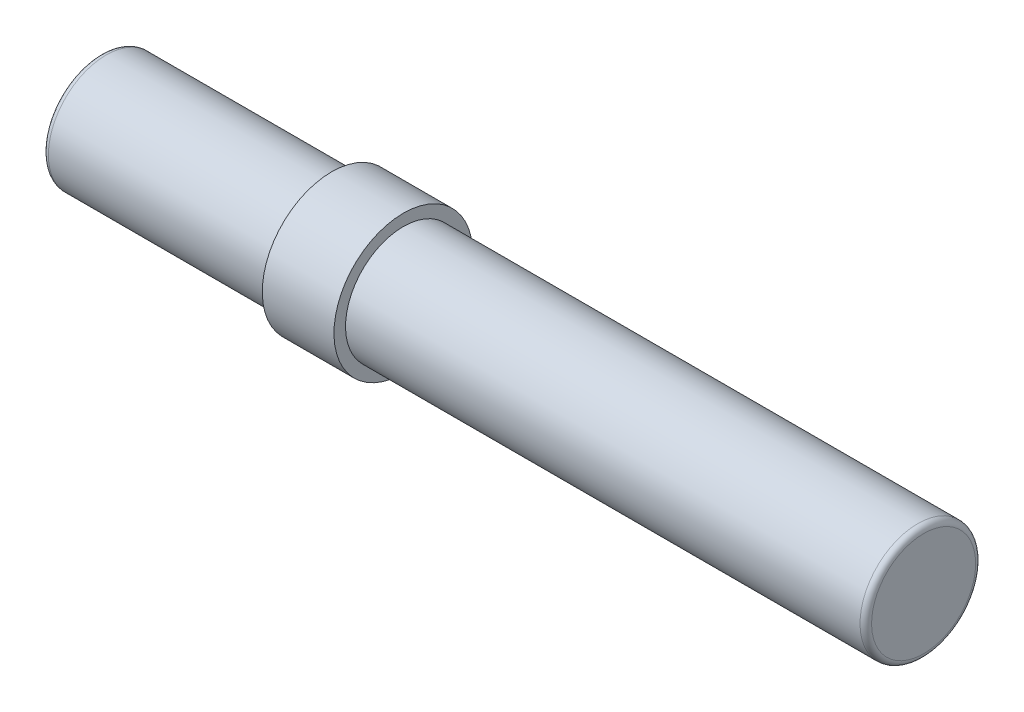
ISO-10303-21;
HEADER;
FILE_DESCRIPTION(('STEP AP214'),'2;1');
FILE_NAME('part.step','',(''),(''),'','','');
FILE_SCHEMA(('AUTOMOTIVE_DESIGN { 1 0 10303 214 1 1 1 1 }'));
ENDSEC;
DATA;
#1=APPLICATION_CONTEXT('core data for automotive mechanical design processes');
#2=APPLICATION_PROTOCOL_DEFINITION('international standard','automotive_design',2000,#1);
#3=PRODUCT_CONTEXT('',#1,'mechanical');
#4=PRODUCT('Part','Part','',(#3));
#5=PRODUCT_RELATED_PRODUCT_CATEGORY('part','',(#4));
#6=PRODUCT_DEFINITION_FORMATION('','',#4);
#7=PRODUCT_DEFINITION_CONTEXT('part definition',#1,'design');
#8=PRODUCT_DEFINITION('design','',#6,#7);
#9=PRODUCT_DEFINITION_SHAPE('','',#8);
#10=(LENGTH_UNIT() NAMED_UNIT(*) SI_UNIT(.MILLI.,.METRE.));
#11=(NAMED_UNIT(*) PLANE_ANGLE_UNIT() SI_UNIT($,.RADIAN.));
#12=(NAMED_UNIT(*) SI_UNIT($,.STERADIAN.) SOLID_ANGLE_UNIT());
#13=UNCERTAINTY_MEASURE_WITH_UNIT(LENGTH_MEASURE(1.E-05),#10,'distance_accuracy_value','');
#14=(GEOMETRIC_REPRESENTATION_CONTEXT(3) GLOBAL_UNCERTAINTY_ASSIGNED_CONTEXT((#13)) GLOBAL_UNIT_ASSIGNED_CONTEXT((#10,
#11,#12)) REPRESENTATION_CONTEXT('',''));
#15=CARTESIAN_POINT('',(0.,0.,0.));
#16=DIRECTION('',(0.,0.,1.));
#17=DIRECTION('',(1.,0.,0.));
#18=AXIS2_PLACEMENT_3D('',#15,#16,#17);
#19=CARTESIAN_POINT('',(-47.1143114184906,0.,0.));
#20=DIRECTION('',(-1.,0.,0.));
#21=DIRECTION('',(0.,-1.,0.));
#22=AXIS2_PLACEMENT_3D('',#19,#20,#21);
#23=PLANE('',#22);
#24=CARTESIAN_POINT('',(-47.1143114184906,0.,0.));
#25=DIRECTION('',(-1.,0.,0.));
#26=DIRECTION('',(0.,-1.,0.));
#27=AXIS2_PLACEMENT_3D('',#24,#25,#26);
#28=CIRCLE('',#27,4.5);
#29=CARTESIAN_POINT('',(-47.1143114184906,-4.5,0.));
#30=VERTEX_POINT('',#29);
#31=EDGE_CURVE('E10',#30,#30,#28,.T.);
#32=ORIENTED_EDGE('',*,*,#31,.T.);
#33=EDGE_LOOP('',(#32));
#34=FACE_BOUND('',#33,.T.);
#35=ADVANCED_FACE('F32',(#34),#23,.T.);
#36=CARTESIAN_POINT('',(24.0856885815094,0.,0.));
#37=DIRECTION('',(1.,0.,0.));
#38=DIRECTION('',(0.,1.,0.));
#39=AXIS2_PLACEMENT_3D('',#36,#37,#38);
#40=CYLINDRICAL_SURFACE('',#39,5.);
#41=CARTESIAN_POINT('',(-46.6143114184906,0.,0.));
#42=DIRECTION('',(-1.,0.,0.));
#43=DIRECTION('',(0.,-1.,0.));
#44=AXIS2_PLACEMENT_3D('',#41,#42,#43);
#45=CIRCLE('',#44,5.);
#46=CARTESIAN_POINT('',(-46.6143114184906,-5.,0.));
#47=VERTEX_POINT('',#46);
#48=EDGE_CURVE('E39',#47,#47,#45,.F.);
#49=ORIENTED_EDGE('',*,*,#48,.T.);
#50=EDGE_LOOP('',(#49));
#51=FACE_BOUND('',#50,.T.);
#52=CARTESIAN_POINT('',(-27.1143114184906,0.,0.));
#53=DIRECTION('',(1.,0.,0.));
#54=DIRECTION('',(0.,1.,0.));
#55=AXIS2_PLACEMENT_3D('',#52,#53,#54);
#56=CIRCLE('',#55,5.);
#57=CARTESIAN_POINT('',(-27.1143114184906,5.,0.));
#58=VERTEX_POINT('',#57);
#59=EDGE_CURVE('E52',#58,#58,#56,.T.);
#60=ORIENTED_EDGE('',*,*,#59,.F.);
#61=EDGE_LOOP('',(#60));
#62=FACE_BOUND('',#61,.T.);
#63=ADVANCED_FACE('F83',(#51,#62),#40,.T.);
#64=CARTESIAN_POINT('',(-27.1143114184906,5.,0.));
#65=DIRECTION('',(-1.,0.,0.));
#66=DIRECTION('',(0.,-1.,0.));
#67=AXIS2_PLACEMENT_3D('',#64,#65,#66);
#68=PLANE('',#67);
#69=ORIENTED_EDGE('',*,*,#59,.T.);
#70=EDGE_LOOP('',(#69));
#71=FACE_BOUND('',#70,.T.);
#72=CARTESIAN_POINT('',(-27.1143114184906,0.,0.));
#73=DIRECTION('',(1.,0.,0.));
#74=DIRECTION('',(0.,1.,0.));
#75=AXIS2_PLACEMENT_3D('',#72,#73,#74);
#76=CIRCLE('',#75,6.);
#77=CARTESIAN_POINT('',(-27.1143114184906,6.,0.));
#78=VERTEX_POINT('',#77);
#79=EDGE_CURVE('E55',#78,#78,#76,.T.);
#80=ORIENTED_EDGE('',*,*,#79,.F.);
#81=EDGE_LOOP('',(#80));
#82=FACE_BOUND('',#81,.T.);
#83=ADVANCED_FACE('F79',(#71,#82),#68,.T.);
#84=CARTESIAN_POINT('',(24.0856885815094,0.,0.));
#85=DIRECTION('',(1.,0.,0.));
#86=DIRECTION('',(0.,1.,0.));
#87=AXIS2_PLACEMENT_3D('',#84,#85,#86);
#88=CYLINDRICAL_SURFACE('',#87,6.);
#89=ORIENTED_EDGE('',*,*,#79,.T.);
#90=EDGE_LOOP('',(#89));
#91=FACE_BOUND('',#90,.T.);
#92=CARTESIAN_POINT('',(-20.9143114184905,0.,0.));
#93=DIRECTION('',(1.,0.,0.));
#94=DIRECTION('',(0.,1.,0.));
#95=AXIS2_PLACEMENT_3D('',#92,#93,#94);
#96=CIRCLE('',#95,6.);
#97=CARTESIAN_POINT('',(-20.9143114184905,6.,0.));
#98=VERTEX_POINT('',#97);
#99=EDGE_CURVE('E58',#98,#98,#96,.T.);
#100=ORIENTED_EDGE('',*,*,#99,.F.);
#101=EDGE_LOOP('',(#100));
#102=FACE_BOUND('',#101,.T.);
#103=ADVANCED_FACE('F69',(#91,#102),#88,.T.);
#104=CARTESIAN_POINT('',(-20.9143114184906,6.,0.));
#105=DIRECTION('',(1.,0.,0.));
#106=DIRECTION('',(0.,1.,0.));
#107=AXIS2_PLACEMENT_3D('',#104,#105,#106);
#108=PLANE('',#107);
#109=ORIENTED_EDGE('',*,*,#99,.T.);
#110=EDGE_LOOP('',(#109));
#111=FACE_BOUND('',#110,.T.);
#112=CARTESIAN_POINT('',(-20.9143114184905,0.,0.));
#113=DIRECTION('',(1.,0.,0.));
#114=DIRECTION('',(0.,1.,0.));
#115=AXIS2_PLACEMENT_3D('',#112,#113,#114);
#116=CIRCLE('',#115,5.00000000000001);
#117=CARTESIAN_POINT('',(-20.9143114184905,5.00000000000001,0.));
#118=VERTEX_POINT('',#117);
#119=EDGE_CURVE('E61',#118,#118,#116,.T.);
#120=ORIENTED_EDGE('',*,*,#119,.F.);
#121=EDGE_LOOP('',(#120));
#122=FACE_BOUND('',#121,.T.);
#123=ADVANCED_FACE('F67',(#111,#122),#108,.T.);
#124=CARTESIAN_POINT('',(24.0856885815094,0.,0.));
#125=DIRECTION('',(1.,0.,0.));
#126=DIRECTION('',(0.,1.,0.));
#127=AXIS2_PLACEMENT_3D('',#124,#125,#126);
#128=CYLINDRICAL_SURFACE('',#127,5.);
#129=CARTESIAN_POINT('',(23.5856885815094,0.,0.));
#130=DIRECTION('',(1.,0.,0.));
#131=DIRECTION('',(0.,1.,0.));
#132=AXIS2_PLACEMENT_3D('',#129,#130,#131);
#133=CIRCLE('',#132,5.);
#134=CARTESIAN_POINT('',(23.5856885815094,5.00000000000001,0.));
#135=VERTEX_POINT('',#134);
#136=EDGE_CURVE('E43',#135,#135,#133,.F.);
#137=ORIENTED_EDGE('',*,*,#136,.T.);
#138=EDGE_LOOP('',(#137));
#139=FACE_BOUND('',#138,.T.);
#140=ORIENTED_EDGE('',*,*,#119,.T.);
#141=EDGE_LOOP('',(#140));
#142=FACE_BOUND('',#141,.T.);
#143=ADVANCED_FACE('F65',(#139,#142),#128,.T.);
#144=CARTESIAN_POINT('',(24.0856885815094,5.00000000000001,0.));
#145=DIRECTION('',(1.,0.,0.));
#146=DIRECTION('',(0.,1.,0.));
#147=AXIS2_PLACEMENT_3D('',#144,#145,#146);
#148=PLANE('',#147);
#149=CARTESIAN_POINT('',(24.0856885815094,0.,0.));
#150=DIRECTION('',(1.,0.,0.));
#151=DIRECTION('',(0.,1.,0.));
#152=AXIS2_PLACEMENT_3D('',#149,#150,#151);
#153=CIRCLE('',#152,4.5);
#154=CARTESIAN_POINT('',(24.0856885815094,4.50000000000001,0.));
#155=VERTEX_POINT('',#154);
#156=EDGE_CURVE('E47',#155,#155,#153,.T.);
#157=ORIENTED_EDGE('',*,*,#156,.T.);
#158=EDGE_LOOP('',(#157));
#159=FACE_BOUND('',#158,.T.);
#160=ADVANCED_FACE('F76',(#159),#148,.T.);
#161=CARTESIAN_POINT('',(23.5856885815094,0.,0.));
#162=DIRECTION('',(1.,0.,0.));
#163=DIRECTION('',(0.,1.,0.));
#164=AXIS2_PLACEMENT_3D('',#161,#162,#163);
#165=TOROIDAL_SURFACE('',#164,4.5,0.5);
#166=ORIENTED_EDGE('',*,*,#136,.F.);
#167=EDGE_LOOP('',(#166));
#168=FACE_BOUND('',#167,.T.);
#169=ORIENTED_EDGE('',*,*,#156,.F.);
#170=EDGE_LOOP('',(#169));
#171=FACE_BOUND('',#170,.T.);
#172=ADVANCED_FACE('F90',(#168,#171),#165,.T.);
#173=CARTESIAN_POINT('',(-46.6143114184906,0.,0.));
#174=DIRECTION('',(-1.,0.,0.));
#175=DIRECTION('',(0.,-1.,0.));
#176=AXIS2_PLACEMENT_3D('',#173,#174,#175);
#177=TOROIDAL_SURFACE('',#176,4.5,0.5);
#178=ORIENTED_EDGE('',*,*,#31,.F.);
#179=EDGE_LOOP('',(#178));
#180=FACE_BOUND('',#179,.T.);
#181=ORIENTED_EDGE('',*,*,#48,.F.);
#182=EDGE_LOOP('',(#181));
#183=FACE_BOUND('',#182,.T.);
#184=ADVANCED_FACE('F34',(#180,#183),#177,.T.);
#185=CLOSED_SHELL('',(#35,#63,#83,#103,#123,#143,#160,#172,#184));
#186=MANIFOLD_SOLID_BREP('B2',#185);
#187=ADVANCED_BREP_SHAPE_REPRESENTATION('',(#18,#186),#14);
#188=SHAPE_DEFINITION_REPRESENTATION(#9,#187);
ENDSEC;
END-ISO-10303-21;
